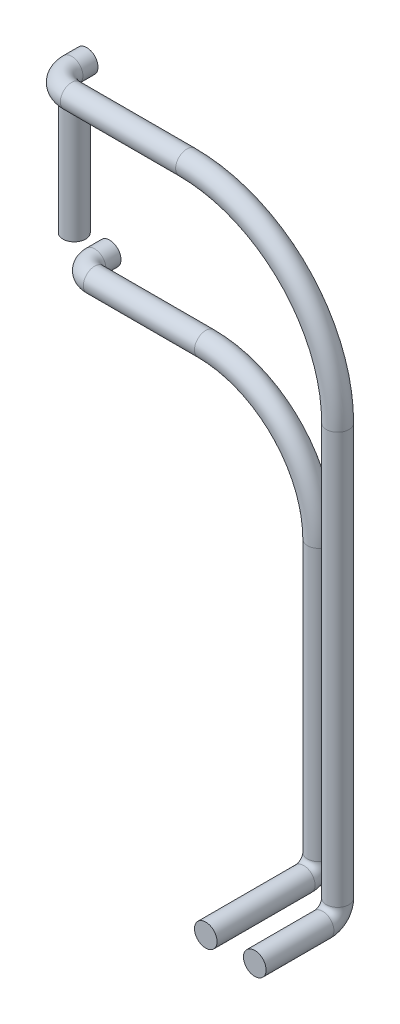
ISO-10303-21;
HEADER;
FILE_DESCRIPTION(('STEP AP214'),'2;1');
FILE_NAME('part.step','',(''),(''),'','','');
FILE_SCHEMA(('AUTOMOTIVE_DESIGN { 1 0 10303 214 1 1 1 1 }'));
ENDSEC;
DATA;
#1=APPLICATION_CONTEXT('core data for automotive mechanical design processes');
#2=APPLICATION_PROTOCOL_DEFINITION('international standard','automotive_design',2000,#1);
#3=PRODUCT_CONTEXT('',#1,'mechanical');
#4=PRODUCT('Part','Part','',(#3));
#5=PRODUCT_RELATED_PRODUCT_CATEGORY('part','',(#4));
#6=PRODUCT_DEFINITION_FORMATION('','',#4);
#7=PRODUCT_DEFINITION_CONTEXT('part definition',#1,'design');
#8=PRODUCT_DEFINITION('design','',#6,#7);
#9=PRODUCT_DEFINITION_SHAPE('','',#8);
#10=(LENGTH_UNIT() NAMED_UNIT(*) SI_UNIT(.MILLI.,.METRE.));
#11=(NAMED_UNIT(*) PLANE_ANGLE_UNIT() SI_UNIT($,.RADIAN.));
#12=(NAMED_UNIT(*) SI_UNIT($,.STERADIAN.) SOLID_ANGLE_UNIT());
#13=UNCERTAINTY_MEASURE_WITH_UNIT(LENGTH_MEASURE(1.E-05),#10,'distance_accuracy_value','');
#14=(GEOMETRIC_REPRESENTATION_CONTEXT(3) GLOBAL_UNCERTAINTY_ASSIGNED_CONTEXT((#13)) GLOBAL_UNIT_ASSIGNED_CONTEXT((#10,
#11,#12)) REPRESENTATION_CONTEXT('',''));
#15=CARTESIAN_POINT('',(0.,0.,0.));
#16=DIRECTION('',(0.,0.,1.));
#17=DIRECTION('',(1.,0.,0.));
#18=AXIS2_PLACEMENT_3D('',#15,#16,#17);
#19=CARTESIAN_POINT('',(6.50000000000001,0.,0.));
#20=DIRECTION('',(0.,0.,1.));
#21=DIRECTION('',(0.,-1.,0.));
#22=AXIS2_PLACEMENT_3D('',#19,#20,#21);
#23=PLANE('',#22);
#24=CARTESIAN_POINT('',(6.50000000000001,0.,0.));
#25=DIRECTION('',(0.,0.,1.));
#26=DIRECTION('',(0.,-1.,0.));
#27=AXIS2_PLACEMENT_3D('',#24,#25,#26);
#28=CIRCLE('',#27,1.5);
#29=CARTESIAN_POINT('',(6.50000000000001,-1.5,0.));
#30=VERTEX_POINT('',#29);
#31=EDGE_CURVE('E88',#30,#30,#28,.T.);
#32=ORIENTED_EDGE('',*,*,#31,.T.);
#33=EDGE_LOOP('',(#32));
#34=FACE_BOUND('',#33,.T.);
#35=ADVANCED_FACE('F76',(#34),#23,.T.);
#36=CARTESIAN_POINT('',(-31.8,76.6,-15.9999999999999));
#37=DIRECTION('',(0.,0.,1.));
#38=DIRECTION('',(1.,0.,0.));
#39=AXIS2_PLACEMENT_3D('',#36,#37,#38);
#40=PLANE('',#39);
#41=CARTESIAN_POINT('',(-31.8,76.6,-15.9999999999999));
#42=DIRECTION('',(0.,0.,1.));
#43=DIRECTION('',(1.,0.,0.));
#44=AXIS2_PLACEMENT_3D('',#41,#42,#43);
#45=CIRCLE('',#44,1.5);
#46=CARTESIAN_POINT('',(-30.3,76.6,-15.9999999999999));
#47=VERTEX_POINT('',#46);
#48=EDGE_CURVE('E13',#47,#47,#45,.T.);
#49=ORIENTED_EDGE('',*,*,#48,.F.);
#50=EDGE_LOOP('',(#49));
#51=FACE_BOUND('',#50,.T.);
#52=ADVANCED_FACE('F94',(#51),#40,.F.);
#53=CARTESIAN_POINT('',(6.50000000000001,0.,0.));
#54=DIRECTION('',(0.,0.,-1.));
#55=DIRECTION('',(-1.,0.,0.));
#56=AXIS2_PLACEMENT_3D('',#53,#54,#55);
#57=CYLINDRICAL_SURFACE('',#56,1.5);
#58=CARTESIAN_POINT('',(6.50000000000001,0.,-9.));
#59=DIRECTION('',(0.,0.,1.));
#60=DIRECTION('',(0.,-1.,0.));
#61=AXIS2_PLACEMENT_3D('',#58,#59,#60);
#62=CIRCLE('',#61,1.5);
#63=CARTESIAN_POINT('',(6.50000000000001,-1.5,-9.));
#64=VERTEX_POINT('',#63);
#65=EDGE_CURVE('E136',#64,#64,#62,.T.);
#66=ORIENTED_EDGE('',*,*,#65,.T.);
#67=EDGE_LOOP('',(#66));
#68=FACE_BOUND('',#67,.T.);
#69=ORIENTED_EDGE('',*,*,#31,.F.);
#70=EDGE_LOOP('',(#69));
#71=FACE_BOUND('',#70,.T.);
#72=ADVANCED_FACE('F96',(#68,#71),#57,.T.);
#73=CARTESIAN_POINT('',(6.50000000000001,2.,-9.));
#74=DIRECTION('',(1.,0.,0.));
#75=DIRECTION('',(0.,0.,-1.));
#76=AXIS2_PLACEMENT_3D('',#73,#74,#75);
#77=TOROIDAL_SURFACE('',#76,2.,1.5);
#78=CARTESIAN_POINT('',(6.50000000000001,2.,-11.));
#79=DIRECTION('',(0.,-1.,0.));
#80=DIRECTION('',(0.,0.,-1.));
#81=AXIS2_PLACEMENT_3D('',#78,#79,#80);
#82=CIRCLE('',#81,1.5);
#83=CARTESIAN_POINT('',(6.50000000000001,2.,-12.5));
#84=VERTEX_POINT('',#83);
#85=EDGE_CURVE('E133',#84,#84,#82,.T.);
#86=CARTESIAN_POINT('',(6.50000000000001,2.,-9.));
#87=DIRECTION('',(1.,0.,0.));
#88=DIRECTION('',(0.,0.,-1.));
#89=AXIS2_PLACEMENT_3D('',#86,#87,#88);
#90=CIRCLE('',#89,3.5);
#91=EDGE_CURVE('',#64,#84,#90,.T.);
#92=ORIENTED_EDGE('',*,*,#65,.F.);
#93=ORIENTED_EDGE('',*,*,#85,.T.);
#94=ORIENTED_EDGE('',*,*,#91,.T.);
#95=ORIENTED_EDGE('',*,*,#91,.F.);
#96=EDGE_LOOP('',(#92,#94,#93,#95));
#97=FACE_BOUND('',#96,.T.);
#98=ADVANCED_FACE('F101',(#97),#77,.T.);
#99=CARTESIAN_POINT('',(6.50000000000001,2.,-11.));
#100=DIRECTION('',(0.,1.,0.));
#101=DIRECTION('',(0.,0.,1.));
#102=AXIS2_PLACEMENT_3D('',#99,#100,#101);
#103=CYLINDRICAL_SURFACE('',#102,1.5);
#104=CARTESIAN_POINT('',(6.50000000000001,56.6,-11.));
#105=DIRECTION('',(0.,-1.,0.));
#106=DIRECTION('',(0.,0.,-1.));
#107=AXIS2_PLACEMENT_3D('',#104,#105,#106);
#108=CIRCLE('',#107,1.5);
#109=CARTESIAN_POINT('',(8.00000000000001,56.6,-11.));
#110=VERTEX_POINT('',#109);
#111=EDGE_CURVE('E138',#110,#110,#108,.T.);
#112=ORIENTED_EDGE('',*,*,#111,.T.);
#113=EDGE_LOOP('',(#112));
#114=FACE_BOUND('',#113,.T.);
#115=ORIENTED_EDGE('',*,*,#85,.F.);
#116=EDGE_LOOP('',(#115));
#117=FACE_BOUND('',#116,.T.);
#118=ADVANCED_FACE('F121',(#114,#117),#103,.T.);
#119=CARTESIAN_POINT('',(-13.5,56.6,-11.));
#120=DIRECTION('',(0.,0.,1.));
#121=DIRECTION('',(1.,0.,0.));
#122=AXIS2_PLACEMENT_3D('',#119,#120,#121);
#123=TOROIDAL_SURFACE('',#122,20.,1.5);
#124=CARTESIAN_POINT('',(-13.5,76.6,-11.));
#125=DIRECTION('',(1.,0.,0.));
#126=DIRECTION('',(0.,0.,-1.));
#127=AXIS2_PLACEMENT_3D('',#124,#125,#126);
#128=CIRCLE('',#127,1.5);
#129=CARTESIAN_POINT('',(-13.5,78.1,-11.));
#130=VERTEX_POINT('',#129);
#131=EDGE_CURVE('E144',#130,#130,#128,.T.);
#132=CARTESIAN_POINT('',(-13.5,56.6,-11.));
#133=DIRECTION('',(0.,0.,1.));
#134=DIRECTION('',(1.,0.,0.));
#135=AXIS2_PLACEMENT_3D('',#132,#133,#134);
#136=CIRCLE('',#135,21.5);
#137=EDGE_CURVE('',#110,#130,#136,.T.);
#138=ORIENTED_EDGE('',*,*,#111,.F.);
#139=ORIENTED_EDGE('',*,*,#131,.T.);
#140=ORIENTED_EDGE('',*,*,#137,.T.);
#141=ORIENTED_EDGE('',*,*,#137,.F.);
#142=EDGE_LOOP('',(#138,#140,#139,#141));
#143=FACE_BOUND('',#142,.T.);
#144=ADVANCED_FACE('F117',(#143),#123,.T.);
#145=CARTESIAN_POINT('',(-13.5,76.6,-11.));
#146=DIRECTION('',(-1.,0.,0.));
#147=DIRECTION('',(0.,0.,1.));
#148=AXIS2_PLACEMENT_3D('',#145,#146,#147);
#149=CYLINDRICAL_SURFACE('',#148,1.5);
#150=CARTESIAN_POINT('',(-28.8,76.6,-10.9999999999999));
#151=DIRECTION('',(1.,0.,0.));
#152=DIRECTION('',(0.,0.,-1.));
#153=AXIS2_PLACEMENT_3D('',#150,#151,#152);
#154=CIRCLE('',#153,1.5);
#155=CARTESIAN_POINT('',(-28.8,76.6,-9.49999999999993));
#156=VERTEX_POINT('',#155);
#157=EDGE_CURVE('E147',#156,#156,#154,.T.);
#158=ORIENTED_EDGE('',*,*,#157,.T.);
#159=EDGE_LOOP('',(#158));
#160=FACE_BOUND('',#159,.T.);
#161=ORIENTED_EDGE('',*,*,#131,.F.);
#162=EDGE_LOOP('',(#161));
#163=FACE_BOUND('',#162,.T.);
#164=ADVANCED_FACE('F111',(#160,#163),#149,.T.);
#165=CARTESIAN_POINT('',(-28.8,76.6,-13.9999999999999));
#166=DIRECTION('',(0.,-1.,0.));
#167=DIRECTION('',(1.,0.,0.));
#168=AXIS2_PLACEMENT_3D('',#165,#166,#167);
#169=TOROIDAL_SURFACE('',#168,3.,1.5);
#170=CARTESIAN_POINT('',(-31.8,76.6,-13.9999999999999));
#171=DIRECTION('',(0.,0.,1.));
#172=DIRECTION('',(1.,0.,0.));
#173=AXIS2_PLACEMENT_3D('',#170,#171,#172);
#174=CIRCLE('',#173,1.5);
#175=CARTESIAN_POINT('',(-33.3,76.6,-13.9999999999999));
#176=VERTEX_POINT('',#175);
#177=EDGE_CURVE('E83',#176,#176,#174,.T.);
#178=CARTESIAN_POINT('',(-28.8,76.6,-13.9999999999999));
#179=DIRECTION('',(0.,-1.,0.));
#180=DIRECTION('',(1.,0.,0.));
#181=AXIS2_PLACEMENT_3D('',#178,#179,#180);
#182=CIRCLE('',#181,4.5);
#183=EDGE_CURVE('',#156,#176,#182,.T.);
#184=ORIENTED_EDGE('',*,*,#157,.F.);
#185=ORIENTED_EDGE('',*,*,#177,.T.);
#186=ORIENTED_EDGE('',*,*,#183,.T.);
#187=ORIENTED_EDGE('',*,*,#183,.F.);
#188=EDGE_LOOP('',(#184,#186,#185,#187));
#189=FACE_BOUND('',#188,.T.);
#190=ADVANCED_FACE('F107',(#189),#169,.T.);
#191=CARTESIAN_POINT('',(-31.8,76.6,-13.9999999999999));
#192=DIRECTION('',(0.,0.,-1.));
#193=DIRECTION('',(-1.,0.,0.));
#194=AXIS2_PLACEMENT_3D('',#191,#192,#193);
#195=CYLINDRICAL_SURFACE('',#194,1.5);
#196=ORIENTED_EDGE('',*,*,#48,.T.);
#197=EDGE_LOOP('',(#196));
#198=FACE_BOUND('',#197,.T.);
#199=ORIENTED_EDGE('',*,*,#177,.F.);
#200=EDGE_LOOP('',(#199));
#201=FACE_BOUND('',#200,.T.);
#202=ADVANCED_FACE('F91',(#198,#201),#195,.T.);
#203=CLOSED_SHELL('',(#35,#52,#72,#98,#118,#144,#164,#190,#202));
#204=MANIFOLD_SOLID_BREP('B2',#203);
#205=CARTESIAN_POINT('',(-36.45,53.,-19.));
#206=DIRECTION('',(0.,1.,0.));
#207=DIRECTION('',(0.,0.,1.));
#208=AXIS2_PLACEMENT_3D('',#205,#206,#207);
#209=PLANE('',#208);
#210=CARTESIAN_POINT('',(-36.45,53.,-19.));
#211=DIRECTION('',(0.,1.,0.));
#212=DIRECTION('',(0.,0.,1.));
#213=AXIS2_PLACEMENT_3D('',#210,#211,#212);
#214=CIRCLE('',#213,1.5);
#215=CARTESIAN_POINT('',(-36.45,53.,-17.5));
#216=VERTEX_POINT('',#215);
#217=EDGE_CURVE('E225',#216,#216,#214,.T.);
#218=ORIENTED_EDGE('',*,*,#217,.F.);
#219=EDGE_LOOP('',(#218));
#220=FACE_BOUND('',#219,.T.);
#221=ADVANCED_FACE('F218',(#220),#209,.F.);
#222=CARTESIAN_POINT('',(-36.45,69.,-19.));
#223=DIRECTION('',(0.,1.,0.));
#224=DIRECTION('',(0.,0.,1.));
#225=AXIS2_PLACEMENT_3D('',#222,#223,#224);
#226=PLANE('',#225);
#227=CARTESIAN_POINT('',(-36.45,69.,-19.));
#228=DIRECTION('',(0.,1.,0.));
#229=DIRECTION('',(0.,0.,1.));
#230=AXIS2_PLACEMENT_3D('',#227,#228,#229);
#231=CIRCLE('',#230,1.5);
#232=CARTESIAN_POINT('',(-36.45,69.,-17.5));
#233=VERTEX_POINT('',#232);
#234=EDGE_CURVE('E74',#233,#233,#231,.T.);
#235=ORIENTED_EDGE('',*,*,#234,.T.);
#236=EDGE_LOOP('',(#235));
#237=FACE_BOUND('',#236,.T.);
#238=ADVANCED_FACE('F232',(#237),#226,.T.);
#239=CARTESIAN_POINT('',(-36.45,53.,-19.));
#240=DIRECTION('',(0.,1.,0.));
#241=DIRECTION('',(0.,0.,1.));
#242=AXIS2_PLACEMENT_3D('',#239,#240,#241);
#243=CYLINDRICAL_SURFACE('',#242,1.5);
#244=ORIENTED_EDGE('',*,*,#234,.F.);
#245=EDGE_LOOP('',(#244));
#246=FACE_BOUND('',#245,.T.);
#247=ORIENTED_EDGE('',*,*,#217,.T.);
#248=EDGE_LOOP('',(#247));
#249=FACE_BOUND('',#248,.T.);
#250=ADVANCED_FACE('F234',(#246,#249),#243,.T.);
#251=CLOSED_SHELL('',(#221,#238,#250));
#252=MANIFOLD_SOLID_BREP('B7',#251);
#253=CARTESIAN_POINT('',(0.,0.,0.));
#254=DIRECTION('',(0.,0.,1.));
#255=DIRECTION('',(0.,-1.,0.));
#256=AXIS2_PLACEMENT_3D('',#253,#254,#255);
#257=PLANE('',#256);
#258=CARTESIAN_POINT('',(0.,0.,0.));
#259=DIRECTION('',(0.,0.,1.));
#260=DIRECTION('',(0.,-1.,0.));
#261=AXIS2_PLACEMENT_3D('',#258,#259,#260);
#262=CIRCLE('',#261,1.5);
#263=CARTESIAN_POINT('',(0.,-1.5,0.));
#264=VERTEX_POINT('',#263);
#265=EDGE_CURVE('E273',#264,#264,#262,.T.);
#266=ORIENTED_EDGE('',*,*,#265,.T.);
#267=EDGE_LOOP('',(#266));
#268=FACE_BOUND('',#267,.T.);
#269=ADVANCED_FACE('F261',(#268),#257,.T.);
#270=CARTESIAN_POINT('',(-31.75,53.,-19.));
#271=DIRECTION('',(0.,0.,1.));
#272=DIRECTION('',(1.,0.,0.));
#273=AXIS2_PLACEMENT_3D('',#270,#271,#272);
#274=PLANE('',#273);
#275=CARTESIAN_POINT('',(-31.75,53.,-19.));
#276=DIRECTION('',(0.,0.,1.));
#277=DIRECTION('',(1.,0.,0.));
#278=AXIS2_PLACEMENT_3D('',#275,#276,#277);
#279=CIRCLE('',#278,1.5);
#280=CARTESIAN_POINT('',(-30.25,53.,-19.));
#281=VERTEX_POINT('',#280);
#282=EDGE_CURVE('E216',#281,#281,#279,.T.);
#283=ORIENTED_EDGE('',*,*,#282,.F.);
#284=EDGE_LOOP('',(#283));
#285=FACE_BOUND('',#284,.T.);
#286=ADVANCED_FACE('F279',(#285),#274,.F.);
#287=CARTESIAN_POINT('',(0.,0.,0.));
#288=DIRECTION('',(0.,0.,-1.));
#289=DIRECTION('',(-1.,0.,0.));
#290=AXIS2_PLACEMENT_3D('',#287,#288,#289);
#291=CYLINDRICAL_SURFACE('',#290,1.5);
#292=CARTESIAN_POINT('',(0.,0.,-13.));
#293=DIRECTION('',(0.,0.,1.));
#294=DIRECTION('',(0.,-1.,0.));
#295=AXIS2_PLACEMENT_3D('',#292,#293,#294);
#296=CIRCLE('',#295,1.5);
#297=CARTESIAN_POINT('',(0.,-1.5,-13.));
#298=VERTEX_POINT('',#297);
#299=EDGE_CURVE('E321',#298,#298,#296,.T.);
#300=ORIENTED_EDGE('',*,*,#299,.T.);
#301=EDGE_LOOP('',(#300));
#302=FACE_BOUND('',#301,.T.);
#303=ORIENTED_EDGE('',*,*,#265,.F.);
#304=EDGE_LOOP('',(#303));
#305=FACE_BOUND('',#304,.T.);
#306=ADVANCED_FACE('F281',(#302,#305),#291,.T.);
#307=CARTESIAN_POINT('',(0.,2.,-13.));
#308=DIRECTION('',(1.,0.,0.));
#309=DIRECTION('',(0.,0.,-1.));
#310=AXIS2_PLACEMENT_3D('',#307,#308,#309);
#311=TOROIDAL_SURFACE('',#310,2.,1.5);
#312=CARTESIAN_POINT('',(0.,2.,-15.));
#313=DIRECTION('',(0.,-1.,0.));
#314=DIRECTION('',(0.,0.,-1.));
#315=AXIS2_PLACEMENT_3D('',#312,#313,#314);
#316=CIRCLE('',#315,1.5);
#317=CARTESIAN_POINT('',(0.,2.,-16.5));
#318=VERTEX_POINT('',#317);
#319=EDGE_CURVE('E318',#318,#318,#316,.T.);
#320=CARTESIAN_POINT('',(0.,2.,-13.));
#321=DIRECTION('',(1.,0.,0.));
#322=DIRECTION('',(0.,0.,-1.));
#323=AXIS2_PLACEMENT_3D('',#320,#321,#322);
#324=CIRCLE('',#323,3.5);
#325=EDGE_CURVE('',#298,#318,#324,.T.);
#326=ORIENTED_EDGE('',*,*,#299,.F.);
#327=ORIENTED_EDGE('',*,*,#319,.T.);
#328=ORIENTED_EDGE('',*,*,#325,.T.);
#329=ORIENTED_EDGE('',*,*,#325,.F.);
#330=EDGE_LOOP('',(#326,#328,#327,#329));
#331=FACE_BOUND('',#330,.T.);
#332=ADVANCED_FACE('F286',(#331),#311,.T.);
#333=CARTESIAN_POINT('',(0.,2.,-15.));
#334=DIRECTION('',(0.,1.,0.));
#335=DIRECTION('',(0.,0.,1.));
#336=AXIS2_PLACEMENT_3D('',#333,#334,#335);
#337=CYLINDRICAL_SURFACE('',#336,1.5);
#338=CARTESIAN_POINT('',(0.,38.,-15.));
#339=DIRECTION('',(0.,-1.,0.));
#340=DIRECTION('',(0.,0.,-1.));
#341=AXIS2_PLACEMENT_3D('',#338,#339,#340);
#342=CIRCLE('',#341,1.5);
#343=CARTESIAN_POINT('',(1.5,38.,-15.));
#344=VERTEX_POINT('',#343);
#345=EDGE_CURVE('E323',#344,#344,#342,.T.);
#346=ORIENTED_EDGE('',*,*,#345,.T.);
#347=EDGE_LOOP('',(#346));
#348=FACE_BOUND('',#347,.T.);
#349=ORIENTED_EDGE('',*,*,#319,.F.);
#350=EDGE_LOOP('',(#349));
#351=FACE_BOUND('',#350,.T.);
#352=ADVANCED_FACE('F306',(#348,#351),#337,.T.);
#353=CARTESIAN_POINT('',(-15.,38.,-15.));
#354=DIRECTION('',(0.,0.,1.));
#355=DIRECTION('',(1.,0.,0.));
#356=AXIS2_PLACEMENT_3D('',#353,#354,#355);
#357=TOROIDAL_SURFACE('',#356,15.,1.5);
#358=CARTESIAN_POINT('',(-15.,53.,-15.));
#359=DIRECTION('',(1.,0.,0.));
#360=DIRECTION('',(0.,0.,-1.));
#361=AXIS2_PLACEMENT_3D('',#358,#359,#360);
#362=CIRCLE('',#361,1.5);
#363=CARTESIAN_POINT('',(-15.,54.5,-15.));
#364=VERTEX_POINT('',#363);
#365=EDGE_CURVE('E329',#364,#364,#362,.T.);
#366=CARTESIAN_POINT('',(-15.,38.,-15.));
#367=DIRECTION('',(0.,0.,1.));
#368=DIRECTION('',(1.,0.,0.));
#369=AXIS2_PLACEMENT_3D('',#366,#367,#368);
#370=CIRCLE('',#369,16.5);
#371=EDGE_CURVE('',#344,#364,#370,.T.);
#372=ORIENTED_EDGE('',*,*,#345,.F.);
#373=ORIENTED_EDGE('',*,*,#365,.T.);
#374=ORIENTED_EDGE('',*,*,#371,.T.);
#375=ORIENTED_EDGE('',*,*,#371,.F.);
#376=EDGE_LOOP('',(#372,#374,#373,#375));
#377=FACE_BOUND('',#376,.T.);
#378=ADVANCED_FACE('F302',(#377),#357,.T.);
#379=CARTESIAN_POINT('',(-15.,53.,-15.));
#380=DIRECTION('',(-1.,0.,0.));
#381=DIRECTION('',(0.,0.,1.));
#382=AXIS2_PLACEMENT_3D('',#379,#380,#381);
#383=CYLINDRICAL_SURFACE('',#382,1.5);
#384=CARTESIAN_POINT('',(-29.75,53.,-15.));
#385=DIRECTION('',(1.,0.,0.));
#386=DIRECTION('',(0.,0.,-1.));
#387=AXIS2_PLACEMENT_3D('',#384,#385,#386);
#388=CIRCLE('',#387,1.5);
#389=CARTESIAN_POINT('',(-29.75,53.,-13.5));
#390=VERTEX_POINT('',#389);
#391=EDGE_CURVE('E332',#390,#390,#388,.T.);
#392=ORIENTED_EDGE('',*,*,#391,.T.);
#393=EDGE_LOOP('',(#392));
#394=FACE_BOUND('',#393,.T.);
#395=ORIENTED_EDGE('',*,*,#365,.F.);
#396=EDGE_LOOP('',(#395));
#397=FACE_BOUND('',#396,.T.);
#398=ADVANCED_FACE('F296',(#394,#397),#383,.T.);
#399=CARTESIAN_POINT('',(-29.75,53.,-17.));
#400=DIRECTION('',(0.,-1.,0.));
#401=DIRECTION('',(0.,0.,-1.));
#402=AXIS2_PLACEMENT_3D('',#399,#400,#401);
#403=TOROIDAL_SURFACE('',#402,2.,1.5);
#404=CARTESIAN_POINT('',(-31.75,53.,-17.));
#405=DIRECTION('',(0.,0.,1.));
#406=DIRECTION('',(1.,0.,0.));
#407=AXIS2_PLACEMENT_3D('',#404,#405,#406);
#408=CIRCLE('',#407,1.5);
#409=CARTESIAN_POINT('',(-33.25,53.,-17.));
#410=VERTEX_POINT('',#409);
#411=EDGE_CURVE('E268',#410,#410,#408,.T.);
#412=CARTESIAN_POINT('',(-29.75,53.,-17.));
#413=DIRECTION('',(0.,-1.,0.));
#414=DIRECTION('',(0.,0.,-1.));
#415=AXIS2_PLACEMENT_3D('',#412,#413,#414);
#416=CIRCLE('',#415,3.5);
#417=EDGE_CURVE('',#390,#410,#416,.T.);
#418=ORIENTED_EDGE('',*,*,#391,.F.);
#419=ORIENTED_EDGE('',*,*,#411,.T.);
#420=ORIENTED_EDGE('',*,*,#417,.T.);
#421=ORIENTED_EDGE('',*,*,#417,.F.);
#422=EDGE_LOOP('',(#418,#420,#419,#421));
#423=FACE_BOUND('',#422,.T.);
#424=ADVANCED_FACE('F292',(#423),#403,.T.);
#425=CARTESIAN_POINT('',(-31.75,53.,-17.));
#426=DIRECTION('',(0.,0.,-1.));
#427=DIRECTION('',(-1.,0.,0.));
#428=AXIS2_PLACEMENT_3D('',#425,#426,#427);
#429=CYLINDRICAL_SURFACE('',#428,1.5);
#430=ORIENTED_EDGE('',*,*,#282,.T.);
#431=EDGE_LOOP('',(#430));
#432=FACE_BOUND('',#431,.T.);
#433=ORIENTED_EDGE('',*,*,#411,.F.);
#434=EDGE_LOOP('',(#433));
#435=FACE_BOUND('',#434,.T.);
#436=ADVANCED_FACE('F276',(#432,#435),#429,.T.);
#437=CLOSED_SHELL('',(#269,#286,#306,#332,#352,#378,#398,#424,#436));
#438=MANIFOLD_SOLID_BREP('B68',#437);
#439=ADVANCED_BREP_SHAPE_REPRESENTATION('',(#18,#204,#252,#438),#14);
#440=SHAPE_DEFINITION_REPRESENTATION(#9,#439);
ENDSEC;
END-ISO-10303-21;
